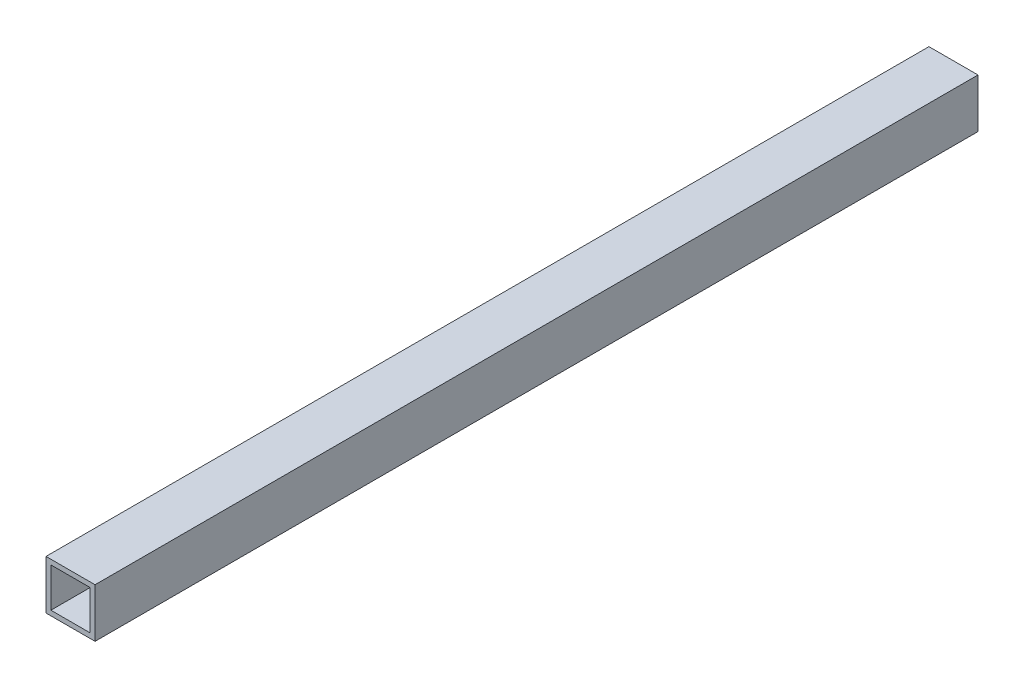
ISO-10303-21;
HEADER;
FILE_DESCRIPTION(('STEP AP214'),'2;1');
FILE_NAME('part.step','',(''),(''),'','','');
FILE_SCHEMA(('AUTOMOTIVE_DESIGN { 1 0 10303 214 1 1 1 1 }'));
ENDSEC;
DATA;
#1=APPLICATION_CONTEXT('core data for automotive mechanical design processes');
#2=APPLICATION_PROTOCOL_DEFINITION('international standard','automotive_design',2000,#1);
#3=PRODUCT_CONTEXT('',#1,'mechanical');
#4=PRODUCT('Part','Part','',(#3));
#5=PRODUCT_RELATED_PRODUCT_CATEGORY('part','',(#4));
#6=PRODUCT_DEFINITION_FORMATION('','',#4);
#7=PRODUCT_DEFINITION_CONTEXT('part definition',#1,'design');
#8=PRODUCT_DEFINITION('design','',#6,#7);
#9=PRODUCT_DEFINITION_SHAPE('','',#8);
#10=(LENGTH_UNIT() NAMED_UNIT(*) SI_UNIT(.MILLI.,.METRE.));
#11=(NAMED_UNIT(*) PLANE_ANGLE_UNIT() SI_UNIT($,.RADIAN.));
#12=(NAMED_UNIT(*) SI_UNIT($,.STERADIAN.) SOLID_ANGLE_UNIT());
#13=UNCERTAINTY_MEASURE_WITH_UNIT(LENGTH_MEASURE(1.E-05),#10,'distance_accuracy_value','');
#14=(GEOMETRIC_REPRESENTATION_CONTEXT(3) GLOBAL_UNCERTAINTY_ASSIGNED_CONTEXT((#13)) GLOBAL_UNIT_ASSIGNED_CONTEXT((#10,
#11,#12)) REPRESENTATION_CONTEXT('',''));
#15=CARTESIAN_POINT('',(0.,0.,0.));
#16=DIRECTION('',(0.,0.,1.));
#17=DIRECTION('',(1.,0.,0.));
#18=AXIS2_PLACEMENT_3D('',#15,#16,#17);
#19=CARTESIAN_POINT('',(0.,0.,180.));
#20=DIRECTION('',(0.,0.,-1.));
#21=DIRECTION('',(-1.,0.,0.));
#22=AXIS2_PLACEMENT_3D('',#19,#20,#21);
#23=PLANE('',#22);
#24=DIRECTION('',(0.,1.,0.));
#25=VECTOR('',#24,1.);
#26=CARTESIAN_POINT('',(5.,-5.,180.));
#27=LINE('',#26,#25);
#28=CARTESIAN_POINT('',(5.,-5.,180.));
#29=VERTEX_POINT('',#28);
#30=CARTESIAN_POINT('',(5.,5.,180.));
#31=VERTEX_POINT('',#30);
#32=EDGE_CURVE('E159',#29,#31,#27,.T.);
#33=ORIENTED_EDGE('',*,*,#32,.T.);
#34=DIRECTION('',(-1.,0.,0.));
#35=VECTOR('',#34,1.);
#36=CARTESIAN_POINT('',(-5.,5.,180.));
#37=LINE('',#36,#35);
#38=CARTESIAN_POINT('',(-5.,5.,180.));
#39=VERTEX_POINT('',#38);
#40=EDGE_CURVE('E163',#31,#39,#37,.T.);
#41=ORIENTED_EDGE('',*,*,#40,.T.);
#42=DIRECTION('',(0.,-1.,0.));
#43=VECTOR('',#42,1.);
#44=CARTESIAN_POINT('',(-5.,-5.,180.));
#45=LINE('',#44,#43);
#46=CARTESIAN_POINT('',(-5.,-5.,180.));
#47=VERTEX_POINT('',#46);
#48=EDGE_CURVE('E167',#39,#47,#45,.T.);
#49=ORIENTED_EDGE('',*,*,#48,.T.);
#50=DIRECTION('',(1.,0.,0.));
#51=VECTOR('',#50,1.);
#52=CARTESIAN_POINT('',(-5.,-5.,180.));
#53=LINE('',#52,#51);
#54=EDGE_CURVE('E170',#47,#29,#53,.T.);
#55=ORIENTED_EDGE('',*,*,#54,.T.);
#56=EDGE_LOOP('',(#33,#41,#49,#55));
#57=FACE_BOUND('',#56,.T.);
#58=DIRECTION('',(0.,1.,0.));
#59=VECTOR('',#58,1.);
#60=CARTESIAN_POINT('',(4.,-4.,180.));
#61=LINE('',#60,#59);
#62=CARTESIAN_POINT('',(4.,-4.,180.));
#63=VERTEX_POINT('',#62);
#64=CARTESIAN_POINT('',(4.,4.,180.));
#65=VERTEX_POINT('',#64);
#66=EDGE_CURVE('E111',#63,#65,#61,.T.);
#67=ORIENTED_EDGE('',*,*,#66,.F.);
#68=DIRECTION('',(1.,0.,0.));
#69=VECTOR('',#68,1.);
#70=CARTESIAN_POINT('',(-4.,-4.,180.));
#71=LINE('',#70,#69);
#72=CARTESIAN_POINT('',(-4.,-4.,180.));
#73=VERTEX_POINT('',#72);
#74=EDGE_CURVE('E137',#73,#63,#71,.T.);
#75=ORIENTED_EDGE('',*,*,#74,.F.);
#76=DIRECTION('',(0.,-1.,0.));
#77=VECTOR('',#76,1.);
#78=CARTESIAN_POINT('',(-4.,-4.,180.));
#79=LINE('',#78,#77);
#80=CARTESIAN_POINT('',(-4.,4.,180.));
#81=VERTEX_POINT('',#80);
#82=EDGE_CURVE('E133',#81,#73,#79,.T.);
#83=ORIENTED_EDGE('',*,*,#82,.F.);
#84=DIRECTION('',(-1.,0.,0.));
#85=VECTOR('',#84,1.);
#86=CARTESIAN_POINT('',(-4.,4.,180.));
#87=LINE('',#86,#85);
#88=EDGE_CURVE('E120',#65,#81,#87,.T.);
#89=ORIENTED_EDGE('',*,*,#88,.F.);
#90=EDGE_LOOP('',(#67,#75,#83,#89));
#91=FACE_BOUND('',#90,.T.);
#92=ADVANCED_FACE('F45',(#57,#91),#23,.F.);
#93=CARTESIAN_POINT('',(0.,0.,0.));
#94=DIRECTION('',(0.,0.,-1.));
#95=DIRECTION('',(-1.,0.,0.));
#96=AXIS2_PLACEMENT_3D('',#93,#94,#95);
#97=PLANE('',#96);
#98=DIRECTION('',(0.,1.,0.));
#99=VECTOR('',#98,1.);
#100=CARTESIAN_POINT('',(5.,-5.,0.));
#101=LINE('',#100,#99);
#102=CARTESIAN_POINT('',(5.,-5.,0.));
#103=VERTEX_POINT('',#102);
#104=CARTESIAN_POINT('',(5.,5.,0.));
#105=VERTEX_POINT('',#104);
#106=EDGE_CURVE('E129',#103,#105,#101,.T.);
#107=ORIENTED_EDGE('',*,*,#106,.F.);
#108=DIRECTION('',(1.,0.,0.));
#109=VECTOR('',#108,1.);
#110=CARTESIAN_POINT('',(-5.,-5.,0.));
#111=LINE('',#110,#109);
#112=CARTESIAN_POINT('',(-5.,-5.,0.));
#113=VERTEX_POINT('',#112);
#114=EDGE_CURVE('E164',#113,#103,#111,.T.);
#115=ORIENTED_EDGE('',*,*,#114,.F.);
#116=DIRECTION('',(0.,-1.,0.));
#117=VECTOR('',#116,1.);
#118=CARTESIAN_POINT('',(-5.,-5.,0.));
#119=LINE('',#118,#117);
#120=CARTESIAN_POINT('',(-5.,5.,0.));
#121=VERTEX_POINT('',#120);
#122=EDGE_CURVE('E180',#121,#113,#119,.T.);
#123=ORIENTED_EDGE('',*,*,#122,.F.);
#124=DIRECTION('',(-1.,0.,0.));
#125=VECTOR('',#124,1.);
#126=CARTESIAN_POINT('',(-5.,5.,0.));
#127=LINE('',#126,#125);
#128=EDGE_CURVE('E177',#105,#121,#127,.T.);
#129=ORIENTED_EDGE('',*,*,#128,.F.);
#130=EDGE_LOOP('',(#107,#115,#123,#129));
#131=FACE_BOUND('',#130,.T.);
#132=DIRECTION('',(1.,0.,0.));
#133=VECTOR('',#132,1.);
#134=CARTESIAN_POINT('',(-4.,-4.,0.));
#135=LINE('',#134,#133);
#136=CARTESIAN_POINT('',(-4.,-4.,0.));
#137=VERTEX_POINT('',#136);
#138=CARTESIAN_POINT('',(4.,-4.,0.));
#139=VERTEX_POINT('',#138);
#140=EDGE_CURVE('E121',#137,#139,#135,.T.);
#141=ORIENTED_EDGE('',*,*,#140,.T.);
#142=DIRECTION('',(0.,1.,0.));
#143=VECTOR('',#142,1.);
#144=CARTESIAN_POINT('',(4.,-4.,0.));
#145=LINE('',#144,#143);
#146=CARTESIAN_POINT('',(4.,4.,0.));
#147=VERTEX_POINT('',#146);
#148=EDGE_CURVE('E69',#139,#147,#145,.T.);
#149=ORIENTED_EDGE('',*,*,#148,.T.);
#150=DIRECTION('',(-1.,0.,0.));
#151=VECTOR('',#150,1.);
#152=CARTESIAN_POINT('',(-4.,4.,0.));
#153=LINE('',#152,#151);
#154=CARTESIAN_POINT('',(-4.,4.,0.));
#155=VERTEX_POINT('',#154);
#156=EDGE_CURVE('E127',#147,#155,#153,.T.);
#157=ORIENTED_EDGE('',*,*,#156,.T.);
#158=DIRECTION('',(0.,-1.,0.));
#159=VECTOR('',#158,1.);
#160=CARTESIAN_POINT('',(-4.,-4.,0.));
#161=LINE('',#160,#159);
#162=EDGE_CURVE('E146',#155,#137,#161,.T.);
#163=ORIENTED_EDGE('',*,*,#162,.T.);
#164=EDGE_LOOP('',(#141,#149,#157,#163));
#165=FACE_BOUND('',#164,.T.);
#166=ADVANCED_FACE('F203',(#131,#165),#97,.T.);
#167=CARTESIAN_POINT('',(5.,-5.,180.));
#168=DIRECTION('',(-1.,0.,0.));
#169=DIRECTION('',(0.,-1.,0.));
#170=AXIS2_PLACEMENT_3D('',#167,#168,#169);
#171=PLANE('',#170);
#172=ORIENTED_EDGE('',*,*,#106,.T.);
#173=DIRECTION('',(0.,0.,-1.));
#174=VECTOR('',#173,1.);
#175=CARTESIAN_POINT('',(5.,5.,180.));
#176=LINE('',#175,#174);
#177=EDGE_CURVE('E11',#31,#105,#176,.T.);
#178=ORIENTED_EDGE('',*,*,#177,.F.);
#179=ORIENTED_EDGE('',*,*,#32,.F.);
#180=DIRECTION('',(0.,0.,-1.));
#181=VECTOR('',#180,1.);
#182=CARTESIAN_POINT('',(5.,-5.,180.));
#183=LINE('',#182,#181);
#184=EDGE_CURVE('E173',#29,#103,#183,.T.);
#185=ORIENTED_EDGE('',*,*,#184,.T.);
#186=EDGE_LOOP('',(#172,#178,#179,#185));
#187=FACE_BOUND('',#186,.T.);
#188=ADVANCED_FACE('F47',(#187),#171,.F.);
#189=CARTESIAN_POINT('',(-5.,5.,180.));
#190=DIRECTION('',(0.,-1.,0.));
#191=DIRECTION('',(1.,0.,0.));
#192=AXIS2_PLACEMENT_3D('',#189,#190,#191);
#193=PLANE('',#192);
#194=ORIENTED_EDGE('',*,*,#128,.T.);
#195=DIRECTION('',(0.,0.,-1.));
#196=VECTOR('',#195,1.);
#197=CARTESIAN_POINT('',(-5.,5.,180.));
#198=LINE('',#197,#196);
#199=EDGE_CURVE('E54',#39,#121,#198,.T.);
#200=ORIENTED_EDGE('',*,*,#199,.F.);
#201=ORIENTED_EDGE('',*,*,#40,.F.);
#202=ORIENTED_EDGE('',*,*,#177,.T.);
#203=EDGE_LOOP('',(#194,#200,#201,#202));
#204=FACE_BOUND('',#203,.T.);
#205=ADVANCED_FACE('F213',(#204),#193,.F.);
#206=CARTESIAN_POINT('',(-5.,-5.,180.));
#207=DIRECTION('',(1.,0.,0.));
#208=DIRECTION('',(0.,0.,-1.));
#209=AXIS2_PLACEMENT_3D('',#206,#207,#208);
#210=PLANE('',#209);
#211=ORIENTED_EDGE('',*,*,#122,.T.);
#212=DIRECTION('',(0.,0.,-1.));
#213=VECTOR('',#212,1.);
#214=CARTESIAN_POINT('',(-5.,-5.,180.));
#215=LINE('',#214,#213);
#216=EDGE_CURVE('E188',#47,#113,#215,.T.);
#217=ORIENTED_EDGE('',*,*,#216,.F.);
#218=ORIENTED_EDGE('',*,*,#48,.F.);
#219=ORIENTED_EDGE('',*,*,#199,.T.);
#220=EDGE_LOOP('',(#211,#217,#218,#219));
#221=FACE_BOUND('',#220,.T.);
#222=ADVANCED_FACE('F197',(#221),#210,.F.);
#223=CARTESIAN_POINT('',(-5.,-5.,180.));
#224=DIRECTION('',(0.,1.,0.));
#225=DIRECTION('',(-1.,0.,0.));
#226=AXIS2_PLACEMENT_3D('',#223,#224,#225);
#227=PLANE('',#226);
#228=ORIENTED_EDGE('',*,*,#114,.T.);
#229=ORIENTED_EDGE('',*,*,#184,.F.);
#230=ORIENTED_EDGE('',*,*,#54,.F.);
#231=ORIENTED_EDGE('',*,*,#216,.T.);
#232=EDGE_LOOP('',(#228,#229,#230,#231));
#233=FACE_BOUND('',#232,.T.);
#234=ADVANCED_FACE('F207',(#233),#227,.F.);
#235=CARTESIAN_POINT('',(4.,-4.,180.));
#236=DIRECTION('',(-1.,0.,0.));
#237=DIRECTION('',(0.,-1.,0.));
#238=AXIS2_PLACEMENT_3D('',#235,#236,#237);
#239=PLANE('',#238);
#240=ORIENTED_EDGE('',*,*,#148,.F.);
#241=DIRECTION('',(0.,0.,-1.));
#242=VECTOR('',#241,1.);
#243=CARTESIAN_POINT('',(4.,-4.,180.));
#244=LINE('',#243,#242);
#245=EDGE_CURVE('E115',#63,#139,#244,.T.);
#246=ORIENTED_EDGE('',*,*,#245,.F.);
#247=ORIENTED_EDGE('',*,*,#66,.T.);
#248=DIRECTION('',(0.,0.,-1.));
#249=VECTOR('',#248,1.);
#250=CARTESIAN_POINT('',(4.,4.,180.));
#251=LINE('',#250,#249);
#252=EDGE_CURVE('E114',#65,#147,#251,.T.);
#253=ORIENTED_EDGE('',*,*,#252,.T.);
#254=EDGE_LOOP('',(#240,#246,#247,#253));
#255=FACE_BOUND('',#254,.T.);
#256=ADVANCED_FACE('F113',(#255),#239,.T.);
#257=CARTESIAN_POINT('',(-4.,4.,180.));
#258=DIRECTION('',(0.,-1.,0.));
#259=DIRECTION('',(1.,0.,0.));
#260=AXIS2_PLACEMENT_3D('',#257,#258,#259);
#261=PLANE('',#260);
#262=ORIENTED_EDGE('',*,*,#156,.F.);
#263=ORIENTED_EDGE('',*,*,#252,.F.);
#264=ORIENTED_EDGE('',*,*,#88,.T.);
#265=DIRECTION('',(0.,0.,-1.));
#266=VECTOR('',#265,1.);
#267=CARTESIAN_POINT('',(-4.,4.,180.));
#268=LINE('',#267,#266);
#269=EDGE_CURVE('E130',#81,#155,#268,.T.);
#270=ORIENTED_EDGE('',*,*,#269,.T.);
#271=EDGE_LOOP('',(#262,#263,#264,#270));
#272=FACE_BOUND('',#271,.T.);
#273=ADVANCED_FACE('F124',(#272),#261,.T.);
#274=CARTESIAN_POINT('',(-4.,-4.,180.));
#275=DIRECTION('',(1.,0.,0.));
#276=DIRECTION('',(0.,1.,0.));
#277=AXIS2_PLACEMENT_3D('',#274,#275,#276);
#278=PLANE('',#277);
#279=ORIENTED_EDGE('',*,*,#162,.F.);
#280=ORIENTED_EDGE('',*,*,#269,.F.);
#281=ORIENTED_EDGE('',*,*,#82,.T.);
#282=DIRECTION('',(0.,0.,-1.));
#283=VECTOR('',#282,1.);
#284=CARTESIAN_POINT('',(-4.,-4.,180.));
#285=LINE('',#284,#283);
#286=EDGE_CURVE('E61',#73,#137,#285,.T.);
#287=ORIENTED_EDGE('',*,*,#286,.T.);
#288=EDGE_LOOP('',(#279,#280,#281,#287));
#289=FACE_BOUND('',#288,.T.);
#290=ADVANCED_FACE('F236',(#289),#278,.T.);
#291=CARTESIAN_POINT('',(-4.,-4.,180.));
#292=DIRECTION('',(0.,1.,0.));
#293=DIRECTION('',(0.,0.,1.));
#294=AXIS2_PLACEMENT_3D('',#291,#292,#293);
#295=PLANE('',#294);
#296=ORIENTED_EDGE('',*,*,#140,.F.);
#297=ORIENTED_EDGE('',*,*,#286,.F.);
#298=ORIENTED_EDGE('',*,*,#74,.T.);
#299=ORIENTED_EDGE('',*,*,#245,.T.);
#300=EDGE_LOOP('',(#296,#297,#298,#299));
#301=FACE_BOUND('',#300,.T.);
#302=ADVANCED_FACE('F240',(#301),#295,.T.);
#303=CLOSED_SHELL('',(#92,#166,#188,#205,#222,#234,#256,#273,#290,#302));
#304=MANIFOLD_SOLID_BREP('B2',#303);
#305=ADVANCED_BREP_SHAPE_REPRESENTATION('',(#18,#304),#14);
#306=SHAPE_DEFINITION_REPRESENTATION(#9,#305);
ENDSEC;
END-ISO-10303-21;
